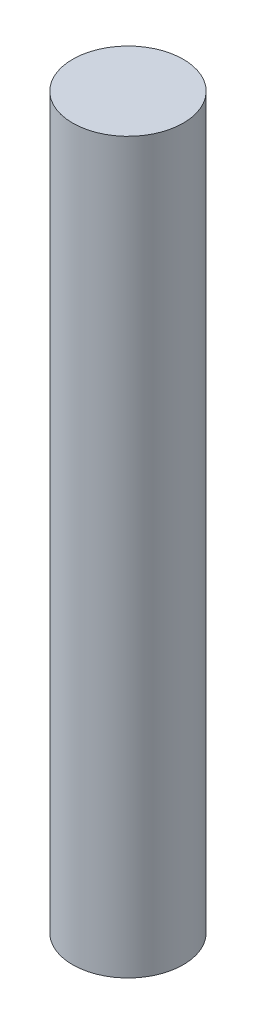
ISO-10303-21;
HEADER;
FILE_DESCRIPTION(('STEP AP214'),'2;1');
FILE_NAME('part.step','',(''),(''),'','','');
FILE_SCHEMA(('AUTOMOTIVE_DESIGN { 1 0 10303 214 1 1 1 1 }'));
ENDSEC;
DATA;
#1=APPLICATION_CONTEXT('core data for automotive mechanical design processes');
#2=APPLICATION_PROTOCOL_DEFINITION('international standard','automotive_design',2000,#1);
#3=PRODUCT_CONTEXT('',#1,'mechanical');
#4=PRODUCT('Part','Part','',(#3));
#5=PRODUCT_RELATED_PRODUCT_CATEGORY('part','',(#4));
#6=PRODUCT_DEFINITION_FORMATION('','',#4);
#7=PRODUCT_DEFINITION_CONTEXT('part definition',#1,'design');
#8=PRODUCT_DEFINITION('design','',#6,#7);
#9=PRODUCT_DEFINITION_SHAPE('','',#8);
#10=(LENGTH_UNIT() NAMED_UNIT(*) SI_UNIT(.MILLI.,.METRE.));
#11=(NAMED_UNIT(*) PLANE_ANGLE_UNIT() SI_UNIT($,.RADIAN.));
#12=(NAMED_UNIT(*) SI_UNIT($,.STERADIAN.) SOLID_ANGLE_UNIT());
#13=UNCERTAINTY_MEASURE_WITH_UNIT(LENGTH_MEASURE(1.E-05),#10,'distance_accuracy_value','');
#14=(GEOMETRIC_REPRESENTATION_CONTEXT(3) GLOBAL_UNCERTAINTY_ASSIGNED_CONTEXT((#13)) GLOBAL_UNIT_ASSIGNED_CONTEXT((#10,
#11,#12)) REPRESENTATION_CONTEXT('',''));
#15=CARTESIAN_POINT('',(0.,0.,0.));
#16=DIRECTION('',(0.,0.,1.));
#17=DIRECTION('',(1.,0.,0.));
#18=AXIS2_PLACEMENT_3D('',#15,#16,#17);
#19=CARTESIAN_POINT('',(0.,142.24,0.));
#20=DIRECTION('',(0.,-1.,0.));
#21=DIRECTION('',(0.,0.,-1.));
#22=AXIS2_PLACEMENT_3D('',#19,#20,#21);
#23=CYLINDRICAL_SURFACE('',#22,10.795);
#24=CARTESIAN_POINT('',(0.,142.24,0.));
#25=DIRECTION('',(0.,1.,0.));
#26=DIRECTION('',(0.,0.,1.));
#27=AXIS2_PLACEMENT_3D('',#24,#25,#26);
#28=CIRCLE('',#27,10.795);
#29=CARTESIAN_POINT('',(0.,142.24,10.795));
#30=VERTEX_POINT('',#29);
#31=EDGE_CURVE('E10',#30,#30,#28,.T.);
#32=ORIENTED_EDGE('',*,*,#31,.F.);
#33=EDGE_LOOP('',(#32));
#34=FACE_BOUND('',#33,.T.);
#35=CARTESIAN_POINT('',(0.,0.,0.));
#36=DIRECTION('',(0.,1.,0.));
#37=DIRECTION('',(0.,0.,1.));
#38=AXIS2_PLACEMENT_3D('',#35,#36,#37);
#39=CIRCLE('',#38,10.795);
#40=CARTESIAN_POINT('',(0.,0.,10.795));
#41=VERTEX_POINT('',#40);
#42=EDGE_CURVE('E46',#41,#41,#39,.T.);
#43=ORIENTED_EDGE('',*,*,#42,.T.);
#44=EDGE_LOOP('',(#43));
#45=FACE_BOUND('',#44,.T.);
#46=ADVANCED_FACE('F43',(#34,#45),#23,.T.);
#47=CARTESIAN_POINT('',(0.,142.24,0.));
#48=DIRECTION('',(0.,1.,0.));
#49=DIRECTION('',(0.,0.,1.));
#50=AXIS2_PLACEMENT_3D('',#47,#48,#49);
#51=PLANE('',#50);
#52=ORIENTED_EDGE('',*,*,#31,.T.);
#53=EDGE_LOOP('',(#52));
#54=FACE_BOUND('',#53,.T.);
#55=ADVANCED_FACE('F60',(#54),#51,.T.);
#56=CARTESIAN_POINT('',(0.,0.,0.));
#57=DIRECTION('',(0.,1.,0.));
#58=DIRECTION('',(0.,0.,1.));
#59=AXIS2_PLACEMENT_3D('',#56,#57,#58);
#60=PLANE('',#59);
#61=ORIENTED_EDGE('',*,*,#42,.F.);
#62=EDGE_LOOP('',(#61));
#63=FACE_BOUND('',#62,.T.);
#64=ADVANCED_FACE('F58',(#63),#60,.F.);
#65=CLOSED_SHELL('',(#46,#55,#64));
#66=MANIFOLD_SOLID_BREP('B2',#65);
#67=ADVANCED_BREP_SHAPE_REPRESENTATION('',(#18,#66),#14);
#68=SHAPE_DEFINITION_REPRESENTATION(#9,#67);
ENDSEC;
END-ISO-10303-21;
